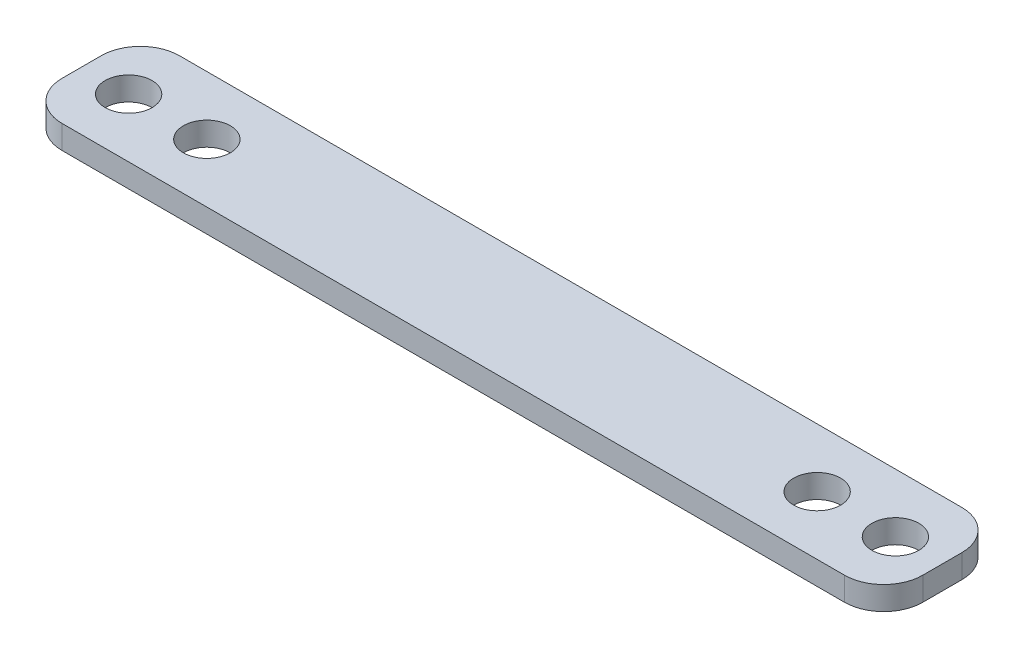
ISO-10303-21;
HEADER;
FILE_DESCRIPTION(('STEP AP214'),'2;1');
FILE_NAME('part.step','',(''),(''),'','','');
FILE_SCHEMA(('AUTOMOTIVE_DESIGN { 1 0 10303 214 1 1 1 1 }'));
ENDSEC;
DATA;
#1=APPLICATION_CONTEXT('core data for automotive mechanical design processes');
#2=APPLICATION_PROTOCOL_DEFINITION('international standard','automotive_design',2000,#1);
#3=PRODUCT_CONTEXT('',#1,'mechanical');
#4=PRODUCT('Part','Part','',(#3));
#5=PRODUCT_RELATED_PRODUCT_CATEGORY('part','',(#4));
#6=PRODUCT_DEFINITION_FORMATION('','',#4);
#7=PRODUCT_DEFINITION_CONTEXT('part definition',#1,'design');
#8=PRODUCT_DEFINITION('design','',#6,#7);
#9=PRODUCT_DEFINITION_SHAPE('','',#8);
#10=(LENGTH_UNIT() NAMED_UNIT(*) SI_UNIT(.MILLI.,.METRE.));
#11=(NAMED_UNIT(*) PLANE_ANGLE_UNIT() SI_UNIT($,.RADIAN.));
#12=(NAMED_UNIT(*) SI_UNIT($,.STERADIAN.) SOLID_ANGLE_UNIT());
#13=UNCERTAINTY_MEASURE_WITH_UNIT(LENGTH_MEASURE(1.E-05),#10,'distance_accuracy_value','');
#14=(GEOMETRIC_REPRESENTATION_CONTEXT(3) GLOBAL_UNCERTAINTY_ASSIGNED_CONTEXT((#13)) GLOBAL_UNIT_ASSIGNED_CONTEXT((#10,
#11,#12)) REPRESENTATION_CONTEXT('',''));
#15=CARTESIAN_POINT('',(0.,0.,0.));
#16=DIRECTION('',(0.,0.,1.));
#17=DIRECTION('',(1.,0.,0.));
#18=AXIS2_PLACEMENT_3D('',#15,#16,#17);
#19=CARTESIAN_POINT('',(-55.,3.,7.50000000000001));
#20=DIRECTION('',(1.,0.,0.));
#21=DIRECTION('',(0.,0.,-1.));
#22=AXIS2_PLACEMENT_3D('',#19,#20,#21);
#23=PLANE('',#22);
#24=DIRECTION('',(0.,0.,1.));
#25=VECTOR('',#24,1.);
#26=CARTESIAN_POINT('',(-55.,0.,7.50000000000001));
#27=LINE('',#26,#25);
#28=CARTESIAN_POINT('',(-55.,0.,-2.49999999999999));
#29=VERTEX_POINT('',#28);
#30=CARTESIAN_POINT('',(-55.,0.,2.5));
#31=VERTEX_POINT('',#30);
#32=EDGE_CURVE('E182',#29,#31,#27,.T.);
#33=ORIENTED_EDGE('',*,*,#32,.T.);
#34=DIRECTION('',(0.,-1.,0.));
#35=VECTOR('',#34,1.);
#36=CARTESIAN_POINT('',(-55.,3.,2.5));
#37=LINE('',#36,#35);
#38=CARTESIAN_POINT('',(-55.,3.,2.5));
#39=VERTEX_POINT('',#38);
#40=EDGE_CURVE('E11',#31,#39,#37,.F.);
#41=ORIENTED_EDGE('',*,*,#40,.T.);
#42=DIRECTION('',(0.,0.,1.));
#43=VECTOR('',#42,1.);
#44=CARTESIAN_POINT('',(-55.,3.,7.50000000000001));
#45=LINE('',#44,#43);
#46=CARTESIAN_POINT('',(-55.,3.,-2.49999999999999));
#47=VERTEX_POINT('',#46);
#48=EDGE_CURVE('E135',#47,#39,#45,.T.);
#49=ORIENTED_EDGE('',*,*,#48,.F.);
#50=DIRECTION('',(0.,-1.,0.));
#51=VECTOR('',#50,1.);
#52=CARTESIAN_POINT('',(-55.,3.,-2.49999999999999));
#53=LINE('',#52,#51);
#54=EDGE_CURVE('E48',#47,#29,#53,.T.);
#55=ORIENTED_EDGE('',*,*,#54,.T.);
#56=EDGE_LOOP('',(#33,#41,#49,#55));
#57=FACE_BOUND('',#56,.T.);
#58=ADVANCED_FACE('F39',(#57),#23,.F.);
#59=CARTESIAN_POINT('',(55.,3.,7.49999999999999));
#60=DIRECTION('',(0.,0.,-1.));
#61=DIRECTION('',(-1.,0.,0.));
#62=AXIS2_PLACEMENT_3D('',#59,#60,#61);
#63=PLANE('',#62);
#64=DIRECTION('',(1.,0.,0.));
#65=VECTOR('',#64,1.);
#66=CARTESIAN_POINT('',(55.,0.,7.49999999999999));
#67=LINE('',#66,#65);
#68=CARTESIAN_POINT('',(-50.,0.,7.50000000000001));
#69=VERTEX_POINT('',#68);
#70=CARTESIAN_POINT('',(50.,0.,7.49999999999999));
#71=VERTEX_POINT('',#70);
#72=EDGE_CURVE('E142',#69,#71,#67,.T.);
#73=ORIENTED_EDGE('',*,*,#72,.T.);
#74=DIRECTION('',(0.,-1.,0.));
#75=VECTOR('',#74,1.);
#76=CARTESIAN_POINT('',(50.,3.,7.49999999999999));
#77=LINE('',#76,#75);
#78=CARTESIAN_POINT('',(50.,3.,7.49999999999999));
#79=VERTEX_POINT('',#78);
#80=EDGE_CURVE('E55',#71,#79,#77,.F.);
#81=ORIENTED_EDGE('',*,*,#80,.T.);
#82=DIRECTION('',(1.,0.,0.));
#83=VECTOR('',#82,1.);
#84=CARTESIAN_POINT('',(55.,3.,7.49999999999999));
#85=LINE('',#84,#83);
#86=CARTESIAN_POINT('',(-50.,3.,7.50000000000001));
#87=VERTEX_POINT('',#86);
#88=EDGE_CURVE('E140',#87,#79,#85,.T.);
#89=ORIENTED_EDGE('',*,*,#88,.F.);
#90=DIRECTION('',(0.,-1.,0.));
#91=VECTOR('',#90,1.);
#92=CARTESIAN_POINT('',(-50.,3.,7.50000000000001));
#93=LINE('',#92,#91);
#94=EDGE_CURVE('E171',#87,#69,#93,.T.);
#95=ORIENTED_EDGE('',*,*,#94,.T.);
#96=EDGE_LOOP('',(#73,#81,#89,#95));
#97=FACE_BOUND('',#96,.T.);
#98=ADVANCED_FACE('F263',(#97),#63,.F.);
#99=CARTESIAN_POINT('',(55.,3.,7.49999999999999));
#100=DIRECTION('',(-1.,0.,0.));
#101=DIRECTION('',(0.,0.,1.));
#102=AXIS2_PLACEMENT_3D('',#99,#100,#101);
#103=PLANE('',#102);
#104=DIRECTION('',(0.,0.,-1.));
#105=VECTOR('',#104,1.);
#106=CARTESIAN_POINT('',(55.,0.,7.49999999999999));
#107=LINE('',#106,#105);
#108=CARTESIAN_POINT('',(55.,0.,2.49999999999999));
#109=VERTEX_POINT('',#108);
#110=CARTESIAN_POINT('',(55.,0.,-2.5));
#111=VERTEX_POINT('',#110);
#112=EDGE_CURVE('E136',#109,#111,#107,.T.);
#113=ORIENTED_EDGE('',*,*,#112,.T.);
#114=DIRECTION('',(0.,-1.,0.));
#115=VECTOR('',#114,1.);
#116=CARTESIAN_POINT('',(55.,3.,-2.5));
#117=LINE('',#116,#115);
#118=CARTESIAN_POINT('',(55.,3.,-2.5));
#119=VERTEX_POINT('',#118);
#120=EDGE_CURVE('E111',#111,#119,#117,.F.);
#121=ORIENTED_EDGE('',*,*,#120,.T.);
#122=DIRECTION('',(0.,0.,-1.));
#123=VECTOR('',#122,1.);
#124=CARTESIAN_POINT('',(55.,3.,7.49999999999999));
#125=LINE('',#124,#123);
#126=CARTESIAN_POINT('',(55.,3.,2.49999999999999));
#127=VERTEX_POINT('',#126);
#128=EDGE_CURVE('E198',#127,#119,#125,.T.);
#129=ORIENTED_EDGE('',*,*,#128,.F.);
#130=DIRECTION('',(0.,-1.,0.));
#131=VECTOR('',#130,1.);
#132=CARTESIAN_POINT('',(55.,3.,2.49999999999999));
#133=LINE('',#132,#131);
#134=EDGE_CURVE('E117',#127,#109,#133,.T.);
#135=ORIENTED_EDGE('',*,*,#134,.T.);
#136=EDGE_LOOP('',(#113,#121,#129,#135));
#137=FACE_BOUND('',#136,.T.);
#138=ADVANCED_FACE('F268',(#137),#103,.F.);
#139=CARTESIAN_POINT('',(55.,3.,-7.50000000000001));
#140=DIRECTION('',(0.,0.,1.));
#141=DIRECTION('',(1.,0.,0.));
#142=AXIS2_PLACEMENT_3D('',#139,#140,#141);
#143=PLANE('',#142);
#144=DIRECTION('',(-1.,0.,0.));
#145=VECTOR('',#144,1.);
#146=CARTESIAN_POINT('',(55.,3.,-7.50000000000001));
#147=LINE('',#146,#145);
#148=CARTESIAN_POINT('',(50.,3.,-7.50000000000001));
#149=VERTEX_POINT('',#148);
#150=CARTESIAN_POINT('',(-50.,3.,-7.49999999999999));
#151=VERTEX_POINT('',#150);
#152=EDGE_CURVE('E127',#149,#151,#147,.T.);
#153=ORIENTED_EDGE('',*,*,#152,.F.);
#154=DIRECTION('',(0.,-1.,0.));
#155=VECTOR('',#154,1.);
#156=CARTESIAN_POINT('',(50.,3.,-7.50000000000001));
#157=LINE('',#156,#155);
#158=CARTESIAN_POINT('',(50.,0.,-7.50000000000001));
#159=VERTEX_POINT('',#158);
#160=EDGE_CURVE('E110',#149,#159,#157,.T.);
#161=ORIENTED_EDGE('',*,*,#160,.T.);
#162=DIRECTION('',(-1.,0.,0.));
#163=VECTOR('',#162,1.);
#164=CARTESIAN_POINT('',(55.,0.,-7.50000000000001));
#165=LINE('',#164,#163);
#166=CARTESIAN_POINT('',(-50.,0.,-7.49999999999999));
#167=VERTEX_POINT('',#166);
#168=EDGE_CURVE('E124',#159,#167,#165,.T.);
#169=ORIENTED_EDGE('',*,*,#168,.T.);
#170=DIRECTION('',(0.,-1.,0.));
#171=VECTOR('',#170,1.);
#172=CARTESIAN_POINT('',(-50.,3.,-7.49999999999999));
#173=LINE('',#172,#171);
#174=EDGE_CURVE('E130',#167,#151,#173,.F.);
#175=ORIENTED_EDGE('',*,*,#174,.T.);
#176=EDGE_LOOP('',(#153,#161,#169,#175));
#177=FACE_BOUND('',#176,.T.);
#178=ADVANCED_FACE('F123',(#177),#143,.F.);
#179=CARTESIAN_POINT('',(0.,3.,0.));
#180=DIRECTION('',(0.,1.,0.));
#181=DIRECTION('',(0.,0.,1.));
#182=AXIS2_PLACEMENT_3D('',#179,#180,#181);
#183=PLANE('',#182);
#184=CARTESIAN_POINT('',(49.,3.,0.));
#185=DIRECTION('',(0.,-1.,0.));
#186=DIRECTION('',(0.,0.,1.));
#187=AXIS2_PLACEMENT_3D('',#184,#185,#186);
#188=CIRCLE('',#187,3.);
#189=CARTESIAN_POINT('',(49.,3.,3.));
#190=VERTEX_POINT('',#189);
#191=EDGE_CURVE('E211',#190,#190,#188,.T.);
#192=ORIENTED_EDGE('',*,*,#191,.T.);
#193=EDGE_LOOP('',(#192));
#194=FACE_BOUND('',#193,.T.);
#195=CARTESIAN_POINT('',(39.,3.,0.));
#196=DIRECTION('',(0.,-1.,0.));
#197=DIRECTION('',(0.,0.,1.));
#198=AXIS2_PLACEMENT_3D('',#195,#196,#197);
#199=CIRCLE('',#198,3.);
#200=CARTESIAN_POINT('',(39.,3.,3.));
#201=VERTEX_POINT('',#200);
#202=EDGE_CURVE('E220',#201,#201,#199,.T.);
#203=ORIENTED_EDGE('',*,*,#202,.T.);
#204=EDGE_LOOP('',(#203));
#205=FACE_BOUND('',#204,.T.);
#206=CARTESIAN_POINT('',(-49.,3.,0.));
#207=DIRECTION('',(0.,1.,0.));
#208=DIRECTION('',(0.,0.,1.));
#209=AXIS2_PLACEMENT_3D('',#206,#207,#208);
#210=CIRCLE('',#209,3.);
#211=CARTESIAN_POINT('',(-49.,3.,3.));
#212=VERTEX_POINT('',#211);
#213=EDGE_CURVE('E193',#212,#212,#210,.T.);
#214=ORIENTED_EDGE('',*,*,#213,.F.);
#215=EDGE_LOOP('',(#214));
#216=FACE_BOUND('',#215,.T.);
#217=CARTESIAN_POINT('',(-39.,3.,0.));
#218=DIRECTION('',(0.,1.,0.));
#219=DIRECTION('',(0.,0.,1.));
#220=AXIS2_PLACEMENT_3D('',#217,#218,#219);
#221=CIRCLE('',#220,3.);
#222=CARTESIAN_POINT('',(-39.,3.,3.));
#223=VERTEX_POINT('',#222);
#224=EDGE_CURVE('E208',#223,#223,#221,.T.);
#225=ORIENTED_EDGE('',*,*,#224,.F.);
#226=EDGE_LOOP('',(#225));
#227=FACE_BOUND('',#226,.T.);
#228=ORIENTED_EDGE('',*,*,#128,.T.);
#229=CARTESIAN_POINT('',(50.,3.,-2.50000000000001));
#230=DIRECTION('',(0.,1.,0.));
#231=DIRECTION('',(0.,0.,1.));
#232=AXIS2_PLACEMENT_3D('',#229,#230,#231);
#233=CIRCLE('',#232,5.);
#234=EDGE_CURVE('E168',#119,#149,#233,.T.);
#235=ORIENTED_EDGE('',*,*,#234,.T.);
#236=ORIENTED_EDGE('',*,*,#152,.T.);
#237=CARTESIAN_POINT('',(-50.,3.,-2.49999999999999));
#238=DIRECTION('',(0.,1.,0.));
#239=DIRECTION('',(0.,0.,1.));
#240=AXIS2_PLACEMENT_3D('',#237,#238,#239);
#241=CIRCLE('',#240,5.);
#242=EDGE_CURVE('E160',#151,#47,#241,.T.);
#243=ORIENTED_EDGE('',*,*,#242,.T.);
#244=ORIENTED_EDGE('',*,*,#48,.T.);
#245=CARTESIAN_POINT('',(-50.,3.,2.50000000000001));
#246=DIRECTION('',(0.,1.,0.));
#247=DIRECTION('',(0.,0.,1.));
#248=AXIS2_PLACEMENT_3D('',#245,#246,#247);
#249=CIRCLE('',#248,5.);
#250=EDGE_CURVE('E62',#39,#87,#249,.T.);
#251=ORIENTED_EDGE('',*,*,#250,.T.);
#252=ORIENTED_EDGE('',*,*,#88,.T.);
#253=CARTESIAN_POINT('',(50.,3.,2.49999999999999));
#254=DIRECTION('',(0.,1.,0.));
#255=DIRECTION('',(0.,0.,1.));
#256=AXIS2_PLACEMENT_3D('',#253,#254,#255);
#257=CIRCLE('',#256,5.);
#258=EDGE_CURVE('E165',#79,#127,#257,.T.);
#259=ORIENTED_EDGE('',*,*,#258,.T.);
#260=EDGE_LOOP('',(#228,#235,#236,#243,#244,#251,#252,#259));
#261=FACE_BOUND('',#260,.T.);
#262=ADVANCED_FACE('F232',(#194,#205,#216,#227,#261),#183,.T.);
#263=CARTESIAN_POINT('',(0.,0.,0.));
#264=DIRECTION('',(0.,1.,0.));
#265=DIRECTION('',(0.,0.,1.));
#266=AXIS2_PLACEMENT_3D('',#263,#264,#265);
#267=PLANE('',#266);
#268=CARTESIAN_POINT('',(49.,0.,0.));
#269=DIRECTION('',(0.,1.,0.));
#270=DIRECTION('',(0.,0.,1.));
#271=AXIS2_PLACEMENT_3D('',#268,#269,#270);
#272=CIRCLE('',#271,3.);
#273=CARTESIAN_POINT('',(49.,0.,3.));
#274=VERTEX_POINT('',#273);
#275=EDGE_CURVE('E224',#274,#274,#272,.T.);
#276=ORIENTED_EDGE('',*,*,#275,.T.);
#277=EDGE_LOOP('',(#276));
#278=FACE_BOUND('',#277,.T.);
#279=CARTESIAN_POINT('',(39.,0.,0.));
#280=DIRECTION('',(0.,1.,0.));
#281=DIRECTION('',(0.,0.,1.));
#282=AXIS2_PLACEMENT_3D('',#279,#280,#281);
#283=CIRCLE('',#282,3.);
#284=CARTESIAN_POINT('',(39.,0.,3.));
#285=VERTEX_POINT('',#284);
#286=EDGE_CURVE('E216',#285,#285,#283,.T.);
#287=ORIENTED_EDGE('',*,*,#286,.T.);
#288=EDGE_LOOP('',(#287));
#289=FACE_BOUND('',#288,.T.);
#290=CARTESIAN_POINT('',(-49.,0.,0.));
#291=DIRECTION('',(0.,1.,0.));
#292=DIRECTION('',(0.,0.,1.));
#293=AXIS2_PLACEMENT_3D('',#290,#291,#292);
#294=CIRCLE('',#293,3.);
#295=CARTESIAN_POINT('',(-49.,0.,3.));
#296=VERTEX_POINT('',#295);
#297=EDGE_CURVE('E188',#296,#296,#294,.F.);
#298=ORIENTED_EDGE('',*,*,#297,.F.);
#299=EDGE_LOOP('',(#298));
#300=FACE_BOUND('',#299,.T.);
#301=CARTESIAN_POINT('',(-39.,0.,0.));
#302=DIRECTION('',(0.,1.,0.));
#303=DIRECTION('',(0.,0.,1.));
#304=AXIS2_PLACEMENT_3D('',#301,#302,#303);
#305=CIRCLE('',#304,3.);
#306=CARTESIAN_POINT('',(-39.,0.,3.));
#307=VERTEX_POINT('',#306);
#308=EDGE_CURVE('E204',#307,#307,#305,.F.);
#309=ORIENTED_EDGE('',*,*,#308,.F.);
#310=EDGE_LOOP('',(#309));
#311=FACE_BOUND('',#310,.T.);
#312=ORIENTED_EDGE('',*,*,#168,.F.);
#313=CARTESIAN_POINT('',(50.,0.,-2.50000000000001));
#314=DIRECTION('',(0.,1.,0.));
#315=DIRECTION('',(0.,0.,1.));
#316=AXIS2_PLACEMENT_3D('',#313,#314,#315);
#317=CIRCLE('',#316,5.);
#318=EDGE_CURVE('E106',#159,#111,#317,.F.);
#319=ORIENTED_EDGE('',*,*,#318,.T.);
#320=ORIENTED_EDGE('',*,*,#112,.F.);
#321=CARTESIAN_POINT('',(50.,0.,2.49999999999999));
#322=DIRECTION('',(0.,1.,0.));
#323=DIRECTION('',(0.,0.,1.));
#324=AXIS2_PLACEMENT_3D('',#321,#322,#323);
#325=CIRCLE('',#324,5.);
#326=EDGE_CURVE('E118',#109,#71,#325,.F.);
#327=ORIENTED_EDGE('',*,*,#326,.T.);
#328=ORIENTED_EDGE('',*,*,#72,.F.);
#329=CARTESIAN_POINT('',(-50.,0.,2.50000000000001));
#330=DIRECTION('',(0.,1.,0.));
#331=DIRECTION('',(0.,0.,1.));
#332=AXIS2_PLACEMENT_3D('',#329,#330,#331);
#333=CIRCLE('',#332,5.);
#334=EDGE_CURVE('E150',#69,#31,#333,.F.);
#335=ORIENTED_EDGE('',*,*,#334,.T.);
#336=ORIENTED_EDGE('',*,*,#32,.F.);
#337=CARTESIAN_POINT('',(-50.,0.,-2.49999999999999));
#338=DIRECTION('',(0.,1.,0.));
#339=DIRECTION('',(0.,0.,1.));
#340=AXIS2_PLACEMENT_3D('',#337,#338,#339);
#341=CIRCLE('',#340,5.);
#342=EDGE_CURVE('E129',#29,#167,#341,.F.);
#343=ORIENTED_EDGE('',*,*,#342,.T.);
#344=EDGE_LOOP('',(#312,#319,#320,#327,#328,#335,#336,#343));
#345=FACE_BOUND('',#344,.T.);
#346=ADVANCED_FACE('F132',(#278,#289,#300,#311,#345),#267,.F.);
#347=CARTESIAN_POINT('',(-39.,-0.00100000000000013,0.));
#348=DIRECTION('',(0.,1.,0.));
#349=DIRECTION('',(0.,0.,1.));
#350=AXIS2_PLACEMENT_3D('',#347,#348,#349);
#351=CYLINDRICAL_SURFACE('',#350,3.);
#352=CARTESIAN_POINT('',(-39.,3.,3.));
#353=CARTESIAN_POINT('',(-39.,2.96875,3.));
#354=CARTESIAN_POINT('',(-39.,2.9375,3.));
#355=CARTESIAN_POINT('',(-39.,2.875,3.));
#356=CARTESIAN_POINT('',(-39.,2.84375,3.));
#357=CARTESIAN_POINT('',(-39.,2.78125,3.));
#358=CARTESIAN_POINT('',(-39.,2.75,3.));
#359=CARTESIAN_POINT('',(-39.,2.6875,3.));
#360=CARTESIAN_POINT('',(-39.,2.65625,3.));
#361=CARTESIAN_POINT('',(-39.,2.59375,3.));
#362=CARTESIAN_POINT('',(-39.,2.5625,3.));
#363=CARTESIAN_POINT('',(-39.,2.5,3.));
#364=CARTESIAN_POINT('',(-39.,2.46875,3.));
#365=CARTESIAN_POINT('',(-39.,2.40625,3.));
#366=CARTESIAN_POINT('',(-39.,2.375,3.));
#367=CARTESIAN_POINT('',(-39.,2.3125,3.));
#368=CARTESIAN_POINT('',(-39.,2.28125,3.));
#369=CARTESIAN_POINT('',(-39.,2.21875,3.));
#370=CARTESIAN_POINT('',(-39.,2.1875,3.));
#371=CARTESIAN_POINT('',(-39.,2.125,3.));
#372=CARTESIAN_POINT('',(-39.,2.09375,3.));
#373=CARTESIAN_POINT('',(-39.,2.03125,3.));
#374=CARTESIAN_POINT('',(-39.,2.,3.));
#375=CARTESIAN_POINT('',(-39.,1.9375,3.));
#376=CARTESIAN_POINT('',(-39.,1.90625,3.));
#377=CARTESIAN_POINT('',(-39.,1.84375,3.));
#378=CARTESIAN_POINT('',(-39.,1.8125,3.));
#379=CARTESIAN_POINT('',(-39.,1.75,3.));
#380=CARTESIAN_POINT('',(-39.,1.71875,3.));
#381=CARTESIAN_POINT('',(-39.,1.65625,3.));
#382=CARTESIAN_POINT('',(-39.,1.625,3.));
#383=CARTESIAN_POINT('',(-39.,1.5625,3.));
#384=CARTESIAN_POINT('',(-39.,1.53125,3.));
#385=CARTESIAN_POINT('',(-39.,1.46875,3.));
#386=CARTESIAN_POINT('',(-39.,1.4375,3.));
#387=CARTESIAN_POINT('',(-39.,1.375,3.));
#388=CARTESIAN_POINT('',(-39.,1.34375,3.));
#389=CARTESIAN_POINT('',(-39.,1.28125,3.));
#390=CARTESIAN_POINT('',(-39.,1.25,3.));
#391=CARTESIAN_POINT('',(-39.,1.1875,3.));
#392=CARTESIAN_POINT('',(-39.,1.15625,3.));
#393=CARTESIAN_POINT('',(-39.,1.09375,3.));
#394=CARTESIAN_POINT('',(-39.,1.0625,3.));
#395=CARTESIAN_POINT('',(-39.,1.,3.));
#396=CARTESIAN_POINT('',(-39.,0.96875,3.));
#397=CARTESIAN_POINT('',(-39.,0.90625,3.));
#398=CARTESIAN_POINT('',(-39.,0.875,3.));
#399=CARTESIAN_POINT('',(-39.,0.8125,3.));
#400=CARTESIAN_POINT('',(-39.,0.78125,3.));
#401=CARTESIAN_POINT('',(-39.,0.71875,3.));
#402=CARTESIAN_POINT('',(-39.,0.6875,3.));
#403=CARTESIAN_POINT('',(-39.,0.625,3.));
#404=CARTESIAN_POINT('',(-39.,0.59375,3.));
#405=CARTESIAN_POINT('',(-39.,0.53125,3.));
#406=CARTESIAN_POINT('',(-39.,0.5,3.));
#407=CARTESIAN_POINT('',(-39.,0.4375,3.));
#408=CARTESIAN_POINT('',(-39.,0.40625,3.));
#409=CARTESIAN_POINT('',(-39.,0.34375,3.));
#410=CARTESIAN_POINT('',(-39.,0.3125,3.));
#411=CARTESIAN_POINT('',(-39.,0.25,3.));
#412=CARTESIAN_POINT('',(-39.,0.21875,3.));
#413=CARTESIAN_POINT('',(-39.,0.15625,3.));
#414=CARTESIAN_POINT('',(-39.,0.125,3.));
#415=CARTESIAN_POINT('',(-39.,0.0625000000000001,3.));
#416=CARTESIAN_POINT('',(-39.,0.0312500000000001,3.));
#417=CARTESIAN_POINT('',(-39.,0.,3.));
#418=B_SPLINE_CURVE_WITH_KNOTS('',3,(#352,#353,#354,#355,#356,#357,#358,#359,#360,#361,#362,
#363,#364,#365,#366,#367,#368,#369,#370,#371,#372,#373,#374,#375,#376,#377,#378,#379,#380,#381,
#382,#383,#384,#385,#386,#387,#388,#389,#390,#391,#392,#393,#394,#395,#396,#397,#398,#399,#400,
#401,#402,#403,#404,#405,#406,#407,#408,#409,#410,#411,#412,#413,#414,#415,#416,#417),
.UNSPECIFIED.,.F.,.F.,(4,2,2,2,2,2,2,2,2,2,2,2,2,2,2,2,2,2,2,2,2,2,2,2,2,2,2,2,2,2,2,2,4),(0.,
0.0937500000000001,0.1875,0.28125,0.375,0.46875,0.5625,0.65625,0.75,0.84375,0.9375,1.03125,
1.125,1.21875,1.3125,1.40625,1.5,1.59375,1.6875,1.78125,1.875,1.96875,2.0625,2.15625,2.25,
2.34375,2.4375,2.53125,2.625,2.71875,2.8125,2.90625,3.),.UNSPECIFIED.);
#419=EDGE_CURVE('BSEAM244',#223,#307,#418,.T.);
#420=ORIENTED_EDGE('',*,*,#224,.T.);
#421=ORIENTED_EDGE('',*,*,#308,.T.);
#422=ORIENTED_EDGE('',*,*,#419,.T.);
#423=ORIENTED_EDGE('',*,*,#419,.F.);
#424=EDGE_LOOP('',(#420,#422,#421,#423));
#425=FACE_BOUND('',#424,.T.);
#426=ADVANCED_FACE('F244',(#425),#351,.F.);
#427=CARTESIAN_POINT('',(-49.,-0.00100000000000013,0.));
#428=DIRECTION('',(0.,1.,0.));
#429=DIRECTION('',(0.,0.,1.));
#430=AXIS2_PLACEMENT_3D('',#427,#428,#429);
#431=CYLINDRICAL_SURFACE('',#430,3.);
#432=CARTESIAN_POINT('',(-49.,3.,3.));
#433=CARTESIAN_POINT('',(-49.,2.96875,3.));
#434=CARTESIAN_POINT('',(-49.,2.9375,3.));
#435=CARTESIAN_POINT('',(-49.,2.875,3.));
#436=CARTESIAN_POINT('',(-49.,2.84375,3.));
#437=CARTESIAN_POINT('',(-49.,2.78125,3.));
#438=CARTESIAN_POINT('',(-49.,2.75,3.));
#439=CARTESIAN_POINT('',(-49.,2.6875,3.));
#440=CARTESIAN_POINT('',(-49.,2.65625,3.));
#441=CARTESIAN_POINT('',(-49.,2.59375,3.));
#442=CARTESIAN_POINT('',(-49.,2.5625,3.));
#443=CARTESIAN_POINT('',(-49.,2.5,3.));
#444=CARTESIAN_POINT('',(-49.,2.46875,3.));
#445=CARTESIAN_POINT('',(-49.,2.40625,3.));
#446=CARTESIAN_POINT('',(-49.,2.375,3.));
#447=CARTESIAN_POINT('',(-49.,2.3125,3.));
#448=CARTESIAN_POINT('',(-49.,2.28125,3.));
#449=CARTESIAN_POINT('',(-49.,2.21875,3.));
#450=CARTESIAN_POINT('',(-49.,2.1875,3.));
#451=CARTESIAN_POINT('',(-49.,2.125,3.));
#452=CARTESIAN_POINT('',(-49.,2.09375,3.));
#453=CARTESIAN_POINT('',(-49.,2.03125,3.));
#454=CARTESIAN_POINT('',(-49.,2.,3.));
#455=CARTESIAN_POINT('',(-49.,1.9375,3.));
#456=CARTESIAN_POINT('',(-49.,1.90625,3.));
#457=CARTESIAN_POINT('',(-49.,1.84375,3.));
#458=CARTESIAN_POINT('',(-49.,1.8125,3.));
#459=CARTESIAN_POINT('',(-49.,1.75,3.));
#460=CARTESIAN_POINT('',(-49.,1.71875,3.));
#461=CARTESIAN_POINT('',(-49.,1.65625,3.));
#462=CARTESIAN_POINT('',(-49.,1.625,3.));
#463=CARTESIAN_POINT('',(-49.,1.5625,3.));
#464=CARTESIAN_POINT('',(-49.,1.53125,3.));
#465=CARTESIAN_POINT('',(-49.,1.46875,3.));
#466=CARTESIAN_POINT('',(-49.,1.4375,3.));
#467=CARTESIAN_POINT('',(-49.,1.375,3.));
#468=CARTESIAN_POINT('',(-49.,1.34375,3.));
#469=CARTESIAN_POINT('',(-49.,1.28125,3.));
#470=CARTESIAN_POINT('',(-49.,1.25,3.));
#471=CARTESIAN_POINT('',(-49.,1.1875,3.));
#472=CARTESIAN_POINT('',(-49.,1.15625,3.));
#473=CARTESIAN_POINT('',(-49.,1.09375,3.));
#474=CARTESIAN_POINT('',(-49.,1.0625,3.));
#475=CARTESIAN_POINT('',(-49.,1.,3.));
#476=CARTESIAN_POINT('',(-49.,0.96875,3.));
#477=CARTESIAN_POINT('',(-49.,0.90625,3.));
#478=CARTESIAN_POINT('',(-49.,0.875,3.));
#479=CARTESIAN_POINT('',(-49.,0.8125,3.));
#480=CARTESIAN_POINT('',(-49.,0.78125,3.));
#481=CARTESIAN_POINT('',(-49.,0.71875,3.));
#482=CARTESIAN_POINT('',(-49.,0.6875,3.));
#483=CARTESIAN_POINT('',(-49.,0.625,3.));
#484=CARTESIAN_POINT('',(-49.,0.59375,3.));
#485=CARTESIAN_POINT('',(-49.,0.53125,3.));
#486=CARTESIAN_POINT('',(-49.,0.5,3.));
#487=CARTESIAN_POINT('',(-49.,0.4375,3.));
#488=CARTESIAN_POINT('',(-49.,0.40625,3.));
#489=CARTESIAN_POINT('',(-49.,0.34375,3.));
#490=CARTESIAN_POINT('',(-49.,0.3125,3.));
#491=CARTESIAN_POINT('',(-49.,0.25,3.));
#492=CARTESIAN_POINT('',(-49.,0.21875,3.));
#493=CARTESIAN_POINT('',(-49.,0.15625,3.));
#494=CARTESIAN_POINT('',(-49.,0.125,3.));
#495=CARTESIAN_POINT('',(-49.,0.0625000000000001,3.));
#496=CARTESIAN_POINT('',(-49.,0.0312500000000001,3.));
#497=CARTESIAN_POINT('',(-49.,0.,3.));
#498=B_SPLINE_CURVE_WITH_KNOTS('',3,(#432,#433,#434,#435,#436,#437,#438,#439,#440,#441,#442,
#443,#444,#445,#446,#447,#448,#449,#450,#451,#452,#453,#454,#455,#456,#457,#458,#459,#460,#461,
#462,#463,#464,#465,#466,#467,#468,#469,#470,#471,#472,#473,#474,#475,#476,#477,#478,#479,#480,
#481,#482,#483,#484,#485,#486,#487,#488,#489,#490,#491,#492,#493,#494,#495,#496,#497),
.UNSPECIFIED.,.F.,.F.,(4,2,2,2,2,2,2,2,2,2,2,2,2,2,2,2,2,2,2,2,2,2,2,2,2,2,2,2,2,2,2,2,4),(0.,
0.0937500000000001,0.1875,0.28125,0.375,0.46875,0.5625,0.65625,0.75,0.84375,0.9375,1.03125,
1.125,1.21875,1.3125,1.40625,1.5,1.59375,1.6875,1.78125,1.875,1.96875,2.0625,2.15625,2.25,
2.34375,2.4375,2.53125,2.625,2.71875,2.8125,2.90625,3.),.UNSPECIFIED.);
#499=EDGE_CURVE('BSEAM253',#212,#296,#498,.T.);
#500=ORIENTED_EDGE('',*,*,#213,.T.);
#501=ORIENTED_EDGE('',*,*,#297,.T.);
#502=ORIENTED_EDGE('',*,*,#499,.T.);
#503=ORIENTED_EDGE('',*,*,#499,.F.);
#504=EDGE_LOOP('',(#500,#502,#501,#503));
#505=FACE_BOUND('',#504,.T.);
#506=ADVANCED_FACE('F253',(#505),#431,.F.);
#507=CARTESIAN_POINT('',(39.,-0.00100000000000013,0.));
#508=DIRECTION('',(0.,1.,0.));
#509=DIRECTION('',(0.,0.,1.));
#510=AXIS2_PLACEMENT_3D('',#507,#508,#509);
#511=CYLINDRICAL_SURFACE('',#510,3.);
#512=CARTESIAN_POINT('',(39.,3.,3.));
#513=CARTESIAN_POINT('',(39.,2.96875,3.));
#514=CARTESIAN_POINT('',(39.,2.9375,3.));
#515=CARTESIAN_POINT('',(39.,2.875,3.));
#516=CARTESIAN_POINT('',(39.,2.84375,3.));
#517=CARTESIAN_POINT('',(39.,2.78125,3.));
#518=CARTESIAN_POINT('',(39.,2.75,3.));
#519=CARTESIAN_POINT('',(39.,2.6875,3.));
#520=CARTESIAN_POINT('',(39.,2.65625,3.));
#521=CARTESIAN_POINT('',(39.,2.59375,3.));
#522=CARTESIAN_POINT('',(39.,2.5625,3.));
#523=CARTESIAN_POINT('',(39.,2.5,3.));
#524=CARTESIAN_POINT('',(39.,2.46875,3.));
#525=CARTESIAN_POINT('',(39.,2.40625,3.));
#526=CARTESIAN_POINT('',(39.,2.375,3.));
#527=CARTESIAN_POINT('',(39.,2.3125,3.));
#528=CARTESIAN_POINT('',(39.,2.28125,3.));
#529=CARTESIAN_POINT('',(39.,2.21875,3.));
#530=CARTESIAN_POINT('',(39.,2.1875,3.));
#531=CARTESIAN_POINT('',(39.,2.125,3.));
#532=CARTESIAN_POINT('',(39.,2.09375,3.));
#533=CARTESIAN_POINT('',(39.,2.03125,3.));
#534=CARTESIAN_POINT('',(39.,2.,3.));
#535=CARTESIAN_POINT('',(39.,1.9375,3.));
#536=CARTESIAN_POINT('',(39.,1.90625,3.));
#537=CARTESIAN_POINT('',(39.,1.84375,3.));
#538=CARTESIAN_POINT('',(39.,1.8125,3.));
#539=CARTESIAN_POINT('',(39.,1.75,3.));
#540=CARTESIAN_POINT('',(39.,1.71875,3.));
#541=CARTESIAN_POINT('',(39.,1.65625,3.));
#542=CARTESIAN_POINT('',(39.,1.625,3.));
#543=CARTESIAN_POINT('',(39.,1.5625,3.));
#544=CARTESIAN_POINT('',(39.,1.53125,3.));
#545=CARTESIAN_POINT('',(39.,1.46875,3.));
#546=CARTESIAN_POINT('',(39.,1.4375,3.));
#547=CARTESIAN_POINT('',(39.,1.375,3.));
#548=CARTESIAN_POINT('',(39.,1.34375,3.));
#549=CARTESIAN_POINT('',(39.,1.28125,3.));
#550=CARTESIAN_POINT('',(39.,1.25,3.));
#551=CARTESIAN_POINT('',(39.,1.1875,3.));
#552=CARTESIAN_POINT('',(39.,1.15625,3.));
#553=CARTESIAN_POINT('',(39.,1.09375,3.));
#554=CARTESIAN_POINT('',(39.,1.0625,3.));
#555=CARTESIAN_POINT('',(39.,1.,3.));
#556=CARTESIAN_POINT('',(39.,0.96875,3.));
#557=CARTESIAN_POINT('',(39.,0.90625,3.));
#558=CARTESIAN_POINT('',(39.,0.875,3.));
#559=CARTESIAN_POINT('',(39.,0.8125,3.));
#560=CARTESIAN_POINT('',(39.,0.78125,3.));
#561=CARTESIAN_POINT('',(39.,0.71875,3.));
#562=CARTESIAN_POINT('',(39.,0.6875,3.));
#563=CARTESIAN_POINT('',(39.,0.625,3.));
#564=CARTESIAN_POINT('',(39.,0.59375,3.));
#565=CARTESIAN_POINT('',(39.,0.53125,3.));
#566=CARTESIAN_POINT('',(39.,0.5,3.));
#567=CARTESIAN_POINT('',(39.,0.4375,3.));
#568=CARTESIAN_POINT('',(39.,0.40625,3.));
#569=CARTESIAN_POINT('',(39.,0.34375,3.));
#570=CARTESIAN_POINT('',(39.,0.3125,3.));
#571=CARTESIAN_POINT('',(39.,0.25,3.));
#572=CARTESIAN_POINT('',(39.,0.21875,3.));
#573=CARTESIAN_POINT('',(39.,0.15625,3.));
#574=CARTESIAN_POINT('',(39.,0.125,3.));
#575=CARTESIAN_POINT('',(39.,0.0625000000000001,3.));
#576=CARTESIAN_POINT('',(39.,0.03125,3.));
#577=CARTESIAN_POINT('',(39.,0.,3.));
#578=B_SPLINE_CURVE_WITH_KNOTS('',3,(#512,#513,#514,#515,#516,#517,#518,#519,#520,#521,#522,
#523,#524,#525,#526,#527,#528,#529,#530,#531,#532,#533,#534,#535,#536,#537,#538,#539,#540,#541,
#542,#543,#544,#545,#546,#547,#548,#549,#550,#551,#552,#553,#554,#555,#556,#557,#558,#559,#560,
#561,#562,#563,#564,#565,#566,#567,#568,#569,#570,#571,#572,#573,#574,#575,#576,#577),
.UNSPECIFIED.,.F.,.F.,(4,2,2,2,2,2,2,2,2,2,2,2,2,2,2,2,2,2,2,2,2,2,2,2,2,2,2,2,2,2,2,2,4),(0.,
0.0937500000000001,0.1875,0.28125,0.375,0.46875,0.5625,0.65625,0.75,0.84375,0.9375,1.03125,
1.125,1.21875,1.3125,1.40625,1.5,1.59375,1.6875,1.78125,1.875,1.96875,2.0625,2.15625,2.25,
2.34375,2.4375,2.53125,2.625,2.71875,2.8125,2.90625,3.),.UNSPECIFIED.);
#579=EDGE_CURVE('BSEAM238',#201,#285,#578,.T.);
#580=ORIENTED_EDGE('',*,*,#202,.F.);
#581=ORIENTED_EDGE('',*,*,#286,.F.);
#582=ORIENTED_EDGE('',*,*,#579,.T.);
#583=ORIENTED_EDGE('',*,*,#579,.F.);
#584=EDGE_LOOP('',(#580,#582,#581,#583));
#585=FACE_BOUND('',#584,.T.);
#586=ADVANCED_FACE('F238',(#585),#511,.F.);
#587=CARTESIAN_POINT('',(49.,-0.00100000000000013,0.));
#588=DIRECTION('',(0.,1.,0.));
#589=DIRECTION('',(0.,0.,1.));
#590=AXIS2_PLACEMENT_3D('',#587,#588,#589);
#591=CYLINDRICAL_SURFACE('',#590,3.);
#592=CARTESIAN_POINT('',(49.,3.,3.));
#593=CARTESIAN_POINT('',(49.,2.96875,3.));
#594=CARTESIAN_POINT('',(49.,2.9375,3.));
#595=CARTESIAN_POINT('',(49.,2.875,3.));
#596=CARTESIAN_POINT('',(49.,2.84375,3.));
#597=CARTESIAN_POINT('',(49.,2.78125,3.));
#598=CARTESIAN_POINT('',(49.,2.75,3.));
#599=CARTESIAN_POINT('',(49.,2.6875,3.));
#600=CARTESIAN_POINT('',(49.,2.65625,3.));
#601=CARTESIAN_POINT('',(49.,2.59375,3.));
#602=CARTESIAN_POINT('',(49.,2.5625,3.));
#603=CARTESIAN_POINT('',(49.,2.5,3.));
#604=CARTESIAN_POINT('',(49.,2.46875,3.));
#605=CARTESIAN_POINT('',(49.,2.40625,3.));
#606=CARTESIAN_POINT('',(49.,2.375,3.));
#607=CARTESIAN_POINT('',(49.,2.3125,3.));
#608=CARTESIAN_POINT('',(49.,2.28125,3.));
#609=CARTESIAN_POINT('',(49.,2.21875,3.));
#610=CARTESIAN_POINT('',(49.,2.1875,3.));
#611=CARTESIAN_POINT('',(49.,2.125,3.));
#612=CARTESIAN_POINT('',(49.,2.09375,3.));
#613=CARTESIAN_POINT('',(49.,2.03125,3.));
#614=CARTESIAN_POINT('',(49.,2.,3.));
#615=CARTESIAN_POINT('',(49.,1.9375,3.));
#616=CARTESIAN_POINT('',(49.,1.90625,3.));
#617=CARTESIAN_POINT('',(49.,1.84375,3.));
#618=CARTESIAN_POINT('',(49.,1.8125,3.));
#619=CARTESIAN_POINT('',(49.,1.75,3.));
#620=CARTESIAN_POINT('',(49.,1.71875,3.));
#621=CARTESIAN_POINT('',(49.,1.65625,3.));
#622=CARTESIAN_POINT('',(49.,1.625,3.));
#623=CARTESIAN_POINT('',(49.,1.5625,3.));
#624=CARTESIAN_POINT('',(49.,1.53125,3.));
#625=CARTESIAN_POINT('',(49.,1.46875,3.));
#626=CARTESIAN_POINT('',(49.,1.4375,3.));
#627=CARTESIAN_POINT('',(49.,1.375,3.));
#628=CARTESIAN_POINT('',(49.,1.34375,3.));
#629=CARTESIAN_POINT('',(49.,1.28125,3.));
#630=CARTESIAN_POINT('',(49.,1.25,3.));
#631=CARTESIAN_POINT('',(49.,1.1875,3.));
#632=CARTESIAN_POINT('',(49.,1.15625,3.));
#633=CARTESIAN_POINT('',(49.,1.09375,3.));
#634=CARTESIAN_POINT('',(49.,1.0625,3.));
#635=CARTESIAN_POINT('',(49.,1.,3.));
#636=CARTESIAN_POINT('',(49.,0.96875,3.));
#637=CARTESIAN_POINT('',(49.,0.90625,3.));
#638=CARTESIAN_POINT('',(49.,0.875,3.));
#639=CARTESIAN_POINT('',(49.,0.8125,3.));
#640=CARTESIAN_POINT('',(49.,0.78125,3.));
#641=CARTESIAN_POINT('',(49.,0.71875,3.));
#642=CARTESIAN_POINT('',(49.,0.6875,3.));
#643=CARTESIAN_POINT('',(49.,0.625,3.));
#644=CARTESIAN_POINT('',(49.,0.59375,3.));
#645=CARTESIAN_POINT('',(49.,0.53125,3.));
#646=CARTESIAN_POINT('',(49.,0.5,3.));
#647=CARTESIAN_POINT('',(49.,0.4375,3.));
#648=CARTESIAN_POINT('',(49.,0.40625,3.));
#649=CARTESIAN_POINT('',(49.,0.34375,3.));
#650=CARTESIAN_POINT('',(49.,0.3125,3.));
#651=CARTESIAN_POINT('',(49.,0.25,3.));
#652=CARTESIAN_POINT('',(49.,0.21875,3.));
#653=CARTESIAN_POINT('',(49.,0.15625,3.));
#654=CARTESIAN_POINT('',(49.,0.125,3.));
#655=CARTESIAN_POINT('',(49.,0.0625000000000001,3.));
#656=CARTESIAN_POINT('',(49.,0.03125,3.));
#657=CARTESIAN_POINT('',(49.,0.,3.));
#658=B_SPLINE_CURVE_WITH_KNOTS('',3,(#592,#593,#594,#595,#596,#597,#598,#599,#600,#601,#602,
#603,#604,#605,#606,#607,#608,#609,#610,#611,#612,#613,#614,#615,#616,#617,#618,#619,#620,#621,
#622,#623,#624,#625,#626,#627,#628,#629,#630,#631,#632,#633,#634,#635,#636,#637,#638,#639,#640,
#641,#642,#643,#644,#645,#646,#647,#648,#649,#650,#651,#652,#653,#654,#655,#656,#657),
.UNSPECIFIED.,.F.,.F.,(4,2,2,2,2,2,2,2,2,2,2,2,2,2,2,2,2,2,2,2,2,2,2,2,2,2,2,2,2,2,2,2,4),(0.,
0.0937500000000001,0.1875,0.28125,0.375,0.46875,0.5625,0.65625,0.75,0.84375,0.9375,1.03125,
1.125,1.21875,1.3125,1.40625,1.5,1.59375,1.6875,1.78125,1.875,1.96875,2.0625,2.15625,2.25,
2.34375,2.4375,2.53125,2.625,2.71875,2.8125,2.90625,3.),.UNSPECIFIED.);
#659=EDGE_CURVE('BSEAM235',#190,#274,#658,.T.);
#660=ORIENTED_EDGE('',*,*,#191,.F.);
#661=ORIENTED_EDGE('',*,*,#275,.F.);
#662=ORIENTED_EDGE('',*,*,#659,.T.);
#663=ORIENTED_EDGE('',*,*,#659,.F.);
#664=EDGE_LOOP('',(#660,#662,#661,#663));
#665=FACE_BOUND('',#664,.T.);
#666=ADVANCED_FACE('F235',(#665),#591,.F.);
#667=CARTESIAN_POINT('',(50.,3.,-2.50000000000001));
#668=DIRECTION('',(0.,-1.,0.));
#669=DIRECTION('',(0.,0.,-1.));
#670=AXIS2_PLACEMENT_3D('',#667,#668,#669);
#671=CYLINDRICAL_SURFACE('',#670,5.);
#672=ORIENTED_EDGE('',*,*,#234,.F.);
#673=ORIENTED_EDGE('',*,*,#120,.F.);
#674=ORIENTED_EDGE('',*,*,#318,.F.);
#675=ORIENTED_EDGE('',*,*,#160,.F.);
#676=EDGE_LOOP('',(#672,#673,#674,#675));
#677=FACE_BOUND('',#676,.T.);
#678=ADVANCED_FACE('F109',(#677),#671,.T.);
#679=CARTESIAN_POINT('',(50.,3.,2.49999999999999));
#680=DIRECTION('',(0.,-1.,0.));
#681=DIRECTION('',(0.,0.,-1.));
#682=AXIS2_PLACEMENT_3D('',#679,#680,#681);
#683=CYLINDRICAL_SURFACE('',#682,5.);
#684=ORIENTED_EDGE('',*,*,#258,.F.);
#685=ORIENTED_EDGE('',*,*,#80,.F.);
#686=ORIENTED_EDGE('',*,*,#326,.F.);
#687=ORIENTED_EDGE('',*,*,#134,.F.);
#688=EDGE_LOOP('',(#684,#685,#686,#687));
#689=FACE_BOUND('',#688,.T.);
#690=ADVANCED_FACE('F274',(#689),#683,.T.);
#691=CARTESIAN_POINT('',(-50.,3.,2.50000000000001));
#692=DIRECTION('',(0.,-1.,0.));
#693=DIRECTION('',(0.,0.,-1.));
#694=AXIS2_PLACEMENT_3D('',#691,#692,#693);
#695=CYLINDRICAL_SURFACE('',#694,5.);
#696=ORIENTED_EDGE('',*,*,#250,.F.);
#697=ORIENTED_EDGE('',*,*,#40,.F.);
#698=ORIENTED_EDGE('',*,*,#334,.F.);
#699=ORIENTED_EDGE('',*,*,#94,.F.);
#700=EDGE_LOOP('',(#696,#697,#698,#699));
#701=FACE_BOUND('',#700,.T.);
#702=ADVANCED_FACE('F276',(#701),#695,.T.);
#703=CARTESIAN_POINT('',(-50.,3.,-2.49999999999999));
#704=DIRECTION('',(0.,-1.,0.));
#705=DIRECTION('',(0.,0.,-1.));
#706=AXIS2_PLACEMENT_3D('',#703,#704,#705);
#707=CYLINDRICAL_SURFACE('',#706,5.);
#708=ORIENTED_EDGE('',*,*,#242,.F.);
#709=ORIENTED_EDGE('',*,*,#174,.F.);
#710=ORIENTED_EDGE('',*,*,#342,.F.);
#711=ORIENTED_EDGE('',*,*,#54,.F.);
#712=EDGE_LOOP('',(#708,#709,#710,#711));
#713=FACE_BOUND('',#712,.T.);
#714=ADVANCED_FACE('F41',(#713),#707,.T.);
#715=CLOSED_SHELL('',(#58,#98,#138,#178,#262,#346,#426,#506,#586,#666,#678,#690,#702,#714));
#716=MANIFOLD_SOLID_BREP('B2',#715);
#717=ADVANCED_BREP_SHAPE_REPRESENTATION('',(#18,#716),#14);
#718=SHAPE_DEFINITION_REPRESENTATION(#9,#717);
ENDSEC;
END-ISO-10303-21;
